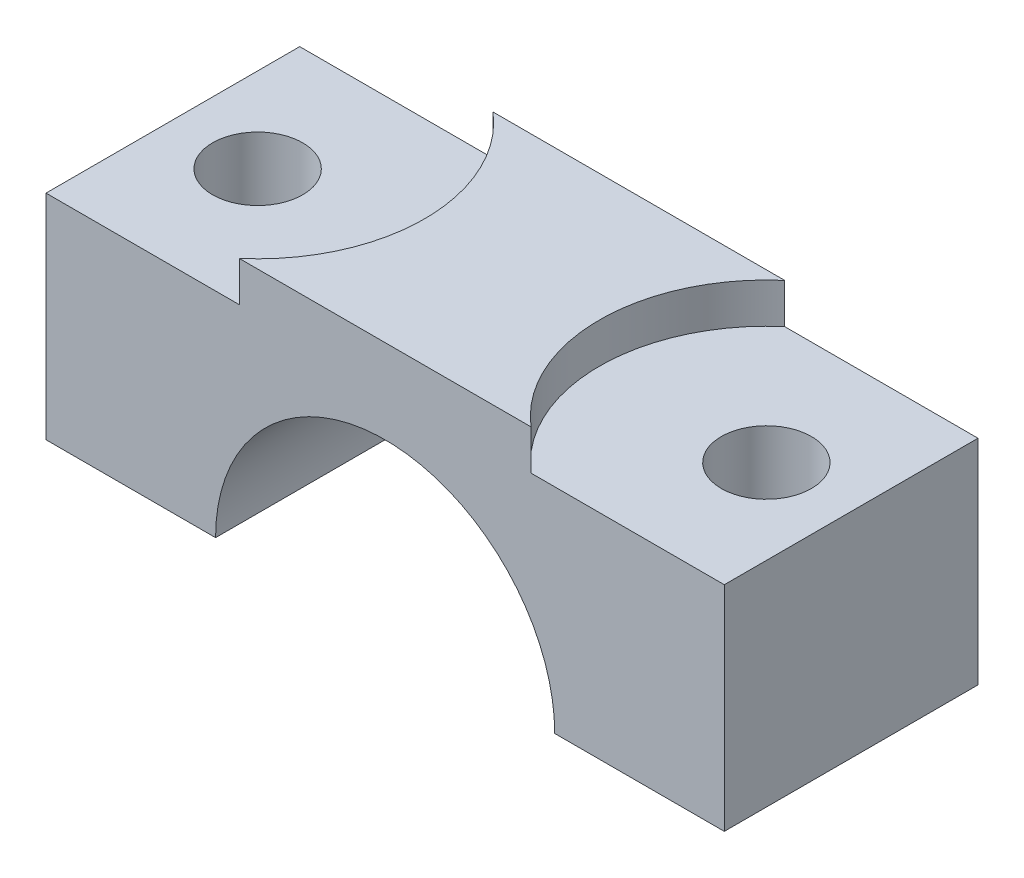
ISO-10303-21;
HEADER;
FILE_DESCRIPTION(('STEP AP214'),'2;1');
FILE_NAME('part.step','',(''),(''),'','','');
FILE_SCHEMA(('AUTOMOTIVE_DESIGN { 1 0 10303 214 1 1 1 1 }'));
ENDSEC;
DATA;
#1=APPLICATION_CONTEXT('core data for automotive mechanical design processes');
#2=APPLICATION_PROTOCOL_DEFINITION('international standard','automotive_design',2000,#1);
#3=PRODUCT_CONTEXT('',#1,'mechanical');
#4=PRODUCT('Part','Part','',(#3));
#5=PRODUCT_RELATED_PRODUCT_CATEGORY('part','',(#4));
#6=PRODUCT_DEFINITION_FORMATION('','',#4);
#7=PRODUCT_DEFINITION_CONTEXT('part definition',#1,'design');
#8=PRODUCT_DEFINITION('design','',#6,#7);
#9=PRODUCT_DEFINITION_SHAPE('','',#8);
#10=(LENGTH_UNIT() NAMED_UNIT(*) SI_UNIT(.MILLI.,.METRE.));
#11=(NAMED_UNIT(*) PLANE_ANGLE_UNIT() SI_UNIT($,.RADIAN.));
#12=(NAMED_UNIT(*) SI_UNIT($,.STERADIAN.) SOLID_ANGLE_UNIT());
#13=UNCERTAINTY_MEASURE_WITH_UNIT(LENGTH_MEASURE(1.E-05),#10,'distance_accuracy_value','');
#14=(GEOMETRIC_REPRESENTATION_CONTEXT(3) GLOBAL_UNCERTAINTY_ASSIGNED_CONTEXT((#13)) GLOBAL_UNIT_ASSIGNED_CONTEXT((#10,
#11,#12)) REPRESENTATION_CONTEXT('',''));
#15=CARTESIAN_POINT('',(0.,0.,0.));
#16=DIRECTION('',(0.,0.,1.));
#17=DIRECTION('',(1.,0.,0.));
#18=AXIS2_PLACEMENT_3D('',#15,#16,#17);
#19=CARTESIAN_POINT('',(-25.4,0.,9.5));
#20=DIRECTION('',(1.,0.,0.));
#21=DIRECTION('',(0.,0.,-1.));
#22=AXIS2_PLACEMENT_3D('',#19,#20,#21);
#23=PLANE('',#22);
#24=DIRECTION('',(0.,-1.,0.));
#25=VECTOR('',#24,1.);
#26=CARTESIAN_POINT('',(-25.4,0.,9.5));
#27=LINE('',#26,#25);
#28=CARTESIAN_POINT('',(-25.4,16.,9.5));
#29=VERTEX_POINT('',#28);
#30=CARTESIAN_POINT('',(-25.4,0.,9.5));
#31=VERTEX_POINT('',#30);
#32=EDGE_CURVE('E150',#29,#31,#27,.T.);
#33=ORIENTED_EDGE('',*,*,#32,.F.);
#34=DIRECTION('',(0.,0.,-1.));
#35=VECTOR('',#34,1.);
#36=CARTESIAN_POINT('',(-25.4,16.,9.5));
#37=LINE('',#36,#35);
#38=CARTESIAN_POINT('',(-25.4,16.,-9.5));
#39=VERTEX_POINT('',#38);
#40=EDGE_CURVE('E115',#29,#39,#37,.T.);
#41=ORIENTED_EDGE('',*,*,#40,.T.);
#42=DIRECTION('',(0.,-1.,0.));
#43=VECTOR('',#42,1.);
#44=CARTESIAN_POINT('',(-25.4,0.,-9.5));
#45=LINE('',#44,#43);
#46=CARTESIAN_POINT('',(-25.4,0.,-9.5));
#47=VERTEX_POINT('',#46);
#48=EDGE_CURVE('E129',#39,#47,#45,.T.);
#49=ORIENTED_EDGE('',*,*,#48,.T.);
#50=DIRECTION('',(0.,0.,-1.));
#51=VECTOR('',#50,1.);
#52=CARTESIAN_POINT('',(-25.4,0.,9.5));
#53=LINE('',#52,#51);
#54=EDGE_CURVE('E185',#31,#47,#53,.T.);
#55=ORIENTED_EDGE('',*,*,#54,.F.);
#56=EDGE_LOOP('',(#33,#41,#49,#55));
#57=FACE_BOUND('',#56,.T.);
#58=ADVANCED_FACE('F33',(#57),#23,.F.);
#59=CARTESIAN_POINT('',(-25.4,0.,9.5));
#60=DIRECTION('',(0.,1.,0.));
#61=DIRECTION('',(-1.,0.,0.));
#62=AXIS2_PLACEMENT_3D('',#59,#60,#61);
#63=PLANE('',#62);
#64=CARTESIAN_POINT('',(-19.05,0.,0.));
#65=DIRECTION('',(0.,1.,0.));
#66=DIRECTION('',(0.,0.,1.));
#67=AXIS2_PLACEMENT_3D('',#64,#65,#66);
#68=CIRCLE('',#67,3.375);
#69=CARTESIAN_POINT('',(-19.05,0.,3.375));
#70=VERTEX_POINT('',#69);
#71=EDGE_CURVE('E116',#70,#70,#68,.T.);
#72=ORIENTED_EDGE('',*,*,#71,.T.);
#73=EDGE_LOOP('',(#72));
#74=FACE_BOUND('',#73,.T.);
#75=DIRECTION('',(1.,0.,0.));
#76=VECTOR('',#75,1.);
#77=CARTESIAN_POINT('',(-25.4,0.,-9.5));
#78=LINE('',#77,#76);
#79=CARTESIAN_POINT('',(-12.7,0.,-9.5));
#80=VERTEX_POINT('',#79);
#81=EDGE_CURVE('E167',#47,#80,#78,.T.);
#82=ORIENTED_EDGE('',*,*,#81,.T.);
#83=DIRECTION('',(0.,0.,-1.));
#84=VECTOR('',#83,1.);
#85=CARTESIAN_POINT('',(-12.7,0.,9.5));
#86=LINE('',#85,#84);
#87=CARTESIAN_POINT('',(-12.7,0.,9.5));
#88=VERTEX_POINT('',#87);
#89=EDGE_CURVE('E182',#88,#80,#86,.T.);
#90=ORIENTED_EDGE('',*,*,#89,.F.);
#91=DIRECTION('',(1.,0.,0.));
#92=VECTOR('',#91,1.);
#93=CARTESIAN_POINT('',(-25.4,0.,9.5));
#94=LINE('',#93,#92);
#95=EDGE_CURVE('E152',#31,#88,#94,.T.);
#96=ORIENTED_EDGE('',*,*,#95,.F.);
#97=ORIENTED_EDGE('',*,*,#54,.T.);
#98=EDGE_LOOP('',(#82,#90,#96,#97));
#99=FACE_BOUND('',#98,.T.);
#100=ADVANCED_FACE('F205',(#74,#99),#63,.F.);
#101=CARTESIAN_POINT('',(0.,0.,9.5));
#102=DIRECTION('',(0.,0.,-1.));
#103=DIRECTION('',(-1.,0.,0.));
#104=AXIS2_PLACEMENT_3D('',#101,#102,#103);
#105=CYLINDRICAL_SURFACE('',#104,12.7);
#106=CARTESIAN_POINT('',(0.,0.,-9.5));
#107=DIRECTION('',(0.,0.,-1.));
#108=DIRECTION('',(-1.,0.,0.));
#109=AXIS2_PLACEMENT_3D('',#106,#107,#108);
#110=CIRCLE('',#109,12.7);
#111=CARTESIAN_POINT('',(12.7,0.,-9.5));
#112=VERTEX_POINT('',#111);
#113=EDGE_CURVE('E169',#80,#112,#110,.T.);
#114=ORIENTED_EDGE('',*,*,#113,.T.);
#115=DIRECTION('',(0.,0.,-1.));
#116=VECTOR('',#115,1.);
#117=CARTESIAN_POINT('',(12.7,0.,9.5));
#118=LINE('',#117,#116);
#119=CARTESIAN_POINT('',(12.7,0.,9.5));
#120=VERTEX_POINT('',#119);
#121=EDGE_CURVE('E179',#120,#112,#118,.T.);
#122=ORIENTED_EDGE('',*,*,#121,.F.);
#123=CARTESIAN_POINT('',(0.,0.,9.5));
#124=DIRECTION('',(0.,0.,-1.));
#125=DIRECTION('',(-1.,0.,0.));
#126=AXIS2_PLACEMENT_3D('',#123,#124,#125);
#127=CIRCLE('',#126,12.7);
#128=EDGE_CURVE('E155',#88,#120,#127,.T.);
#129=ORIENTED_EDGE('',*,*,#128,.F.);
#130=ORIENTED_EDGE('',*,*,#89,.T.);
#131=EDGE_LOOP('',(#114,#122,#129,#130));
#132=FACE_BOUND('',#131,.T.);
#133=ADVANCED_FACE('F225',(#132),#105,.F.);
#134=CARTESIAN_POINT('',(12.7,0.,9.5));
#135=DIRECTION('',(0.,1.,0.));
#136=DIRECTION('',(-1.,0.,0.));
#137=AXIS2_PLACEMENT_3D('',#134,#135,#136);
#138=PLANE('',#137);
#139=CARTESIAN_POINT('',(19.05,0.,0.));
#140=DIRECTION('',(0.,1.,0.));
#141=DIRECTION('',(0.,0.,1.));
#142=AXIS2_PLACEMENT_3D('',#139,#140,#141);
#143=CIRCLE('',#142,3.375);
#144=CARTESIAN_POINT('',(19.05,0.,3.375));
#145=VERTEX_POINT('',#144);
#146=EDGE_CURVE('E140',#145,#145,#143,.T.);
#147=ORIENTED_EDGE('',*,*,#146,.T.);
#148=EDGE_LOOP('',(#147));
#149=FACE_BOUND('',#148,.T.);
#150=DIRECTION('',(1.,0.,0.));
#151=VECTOR('',#150,1.);
#152=CARTESIAN_POINT('',(12.7,0.,-9.5));
#153=LINE('',#152,#151);
#154=CARTESIAN_POINT('',(25.4,0.,-9.5));
#155=VERTEX_POINT('',#154);
#156=EDGE_CURVE('E171',#112,#155,#153,.T.);
#157=ORIENTED_EDGE('',*,*,#156,.T.);
#158=DIRECTION('',(0.,0.,-1.));
#159=VECTOR('',#158,1.);
#160=CARTESIAN_POINT('',(25.4,0.,9.5));
#161=LINE('',#160,#159);
#162=CARTESIAN_POINT('',(25.4,0.,9.5));
#163=VERTEX_POINT('',#162);
#164=EDGE_CURVE('E165',#163,#155,#161,.T.);
#165=ORIENTED_EDGE('',*,*,#164,.F.);
#166=DIRECTION('',(1.,0.,0.));
#167=VECTOR('',#166,1.);
#168=CARTESIAN_POINT('',(12.7,0.,9.5));
#169=LINE('',#168,#167);
#170=EDGE_CURVE('E157',#120,#163,#169,.T.);
#171=ORIENTED_EDGE('',*,*,#170,.F.);
#172=ORIENTED_EDGE('',*,*,#121,.T.);
#173=EDGE_LOOP('',(#157,#165,#171,#172));
#174=FACE_BOUND('',#173,.T.);
#175=ADVANCED_FACE('F237',(#149,#174),#138,.F.);
#176=CARTESIAN_POINT('',(25.4,0.,9.5));
#177=DIRECTION('',(-1.,0.,0.));
#178=DIRECTION('',(0.,0.,1.));
#179=AXIS2_PLACEMENT_3D('',#176,#177,#178);
#180=PLANE('',#179);
#181=DIRECTION('',(0.,1.,0.));
#182=VECTOR('',#181,1.);
#183=CARTESIAN_POINT('',(25.4,0.,-9.5));
#184=LINE('',#183,#182);
#185=CARTESIAN_POINT('',(25.4,16.,-9.5));
#186=VERTEX_POINT('',#185);
#187=EDGE_CURVE('E173',#155,#186,#184,.T.);
#188=ORIENTED_EDGE('',*,*,#187,.T.);
#189=DIRECTION('',(0.,0.,1.));
#190=VECTOR('',#189,1.);
#191=CARTESIAN_POINT('',(25.4,16.,9.5));
#192=LINE('',#191,#190);
#193=CARTESIAN_POINT('',(25.4,16.,9.5));
#194=VERTEX_POINT('',#193);
#195=EDGE_CURVE('E145',#186,#194,#192,.T.);
#196=ORIENTED_EDGE('',*,*,#195,.T.);
#197=DIRECTION('',(0.,1.,0.));
#198=VECTOR('',#197,1.);
#199=CARTESIAN_POINT('',(25.4,0.,9.5));
#200=LINE('',#199,#198);
#201=EDGE_CURVE('E159',#163,#194,#200,.T.);
#202=ORIENTED_EDGE('',*,*,#201,.F.);
#203=ORIENTED_EDGE('',*,*,#164,.T.);
#204=EDGE_LOOP('',(#188,#196,#202,#203));
#205=FACE_BOUND('',#204,.T.);
#206=ADVANCED_FACE('F241',(#205),#180,.F.);
#207=CARTESIAN_POINT('',(-25.4,19.,9.5));
#208=DIRECTION('',(0.,-1.,0.));
#209=DIRECTION('',(0.,0.,-1.));
#210=AXIS2_PLACEMENT_3D('',#207,#208,#209);
#211=PLANE('',#210);
#212=DIRECTION('',(-1.,0.,0.));
#213=VECTOR('',#212,1.);
#214=CARTESIAN_POINT('',(-25.4,19.,-9.5));
#215=LINE('',#214,#213);
#216=CARTESIAN_POINT('',(10.925961595364,19.,-9.5));
#217=VERTEX_POINT('',#216);
#218=CARTESIAN_POINT('',(-10.925961595364,19.,-9.5));
#219=VERTEX_POINT('',#218);
#220=EDGE_CURVE('E153',#217,#219,#215,.T.);
#221=ORIENTED_EDGE('',*,*,#220,.T.);
#222=CARTESIAN_POINT('',(-19.05,19.,0.));
#223=DIRECTION('',(0.,1.,0.));
#224=DIRECTION('',(0.,0.,1.));
#225=AXIS2_PLACEMENT_3D('',#222,#223,#224);
#226=CIRCLE('',#225,12.5);
#227=CARTESIAN_POINT('',(-10.925961595364,19.,9.5));
#228=VERTEX_POINT('',#227);
#229=EDGE_CURVE('E110',#228,#219,#226,.T.);
#230=ORIENTED_EDGE('',*,*,#229,.F.);
#231=DIRECTION('',(-1.,0.,0.));
#232=VECTOR('',#231,1.);
#233=CARTESIAN_POINT('',(-25.4,19.,9.5));
#234=LINE('',#233,#232);
#235=CARTESIAN_POINT('',(10.925961595364,19.,9.5));
#236=VERTEX_POINT('',#235);
#237=EDGE_CURVE('E162',#236,#228,#234,.T.);
#238=ORIENTED_EDGE('',*,*,#237,.F.);
#239=CARTESIAN_POINT('',(19.05,19.,0.));
#240=DIRECTION('',(0.,1.,0.));
#241=DIRECTION('',(0.,0.,1.));
#242=AXIS2_PLACEMENT_3D('',#239,#240,#241);
#243=CIRCLE('',#242,12.5);
#244=EDGE_CURVE('E55',#217,#236,#243,.T.);
#245=ORIENTED_EDGE('',*,*,#244,.F.);
#246=EDGE_LOOP('',(#221,#230,#238,#245));
#247=FACE_BOUND('',#246,.T.);
#248=ADVANCED_FACE('F197',(#247),#211,.F.);
#249=CARTESIAN_POINT('',(0.,0.,9.5));
#250=DIRECTION('',(0.,0.,-1.));
#251=DIRECTION('',(-1.,0.,0.));
#252=AXIS2_PLACEMENT_3D('',#249,#250,#251);
#253=PLANE('',#252);
#254=DIRECTION('',(0.,1.,0.));
#255=VECTOR('',#254,1.);
#256=CARTESIAN_POINT('',(-10.925961595364,19.,9.5));
#257=LINE('',#256,#255);
#258=CARTESIAN_POINT('',(-10.925961595364,16.,9.5));
#259=VERTEX_POINT('',#258);
#260=EDGE_CURVE('E40',#228,#259,#257,.F.);
#261=ORIENTED_EDGE('',*,*,#260,.T.);
#262=DIRECTION('',(-1.,0.,0.));
#263=VECTOR('',#262,1.);
#264=CARTESIAN_POINT('',(0.,16.,9.5));
#265=LINE('',#264,#263);
#266=EDGE_CURVE('E11',#259,#29,#265,.T.);
#267=ORIENTED_EDGE('',*,*,#266,.T.);
#268=ORIENTED_EDGE('',*,*,#32,.T.);
#269=ORIENTED_EDGE('',*,*,#95,.T.);
#270=ORIENTED_EDGE('',*,*,#128,.T.);
#271=ORIENTED_EDGE('',*,*,#170,.T.);
#272=ORIENTED_EDGE('',*,*,#201,.T.);
#273=DIRECTION('',(-1.,0.,0.));
#274=VECTOR('',#273,1.);
#275=CARTESIAN_POINT('',(0.,16.,9.5));
#276=LINE('',#275,#274);
#277=CARTESIAN_POINT('',(10.925961595364,16.,9.5));
#278=VERTEX_POINT('',#277);
#279=EDGE_CURVE('E190',#194,#278,#276,.T.);
#280=ORIENTED_EDGE('',*,*,#279,.T.);
#281=DIRECTION('',(0.,1.,0.));
#282=VECTOR('',#281,1.);
#283=CARTESIAN_POINT('',(10.925961595364,19.,9.5));
#284=LINE('',#283,#282);
#285=EDGE_CURVE('E188',#278,#236,#284,.T.);
#286=ORIENTED_EDGE('',*,*,#285,.T.);
#287=ORIENTED_EDGE('',*,*,#237,.T.);
#288=EDGE_LOOP('',(#261,#267,#268,#269,#270,#271,#272,#280,#286,#287));
#289=FACE_BOUND('',#288,.T.);
#290=ADVANCED_FACE('F193',(#289),#253,.F.);
#291=CARTESIAN_POINT('',(0.,0.,-9.5));
#292=DIRECTION('',(0.,0.,-1.));
#293=DIRECTION('',(-1.,0.,0.));
#294=AXIS2_PLACEMENT_3D('',#291,#292,#293);
#295=PLANE('',#294);
#296=DIRECTION('',(-1.,0.,0.));
#297=VECTOR('',#296,1.);
#298=CARTESIAN_POINT('',(0.,16.,-9.5));
#299=LINE('',#298,#297);
#300=CARTESIAN_POINT('',(-10.925961595364,16.,-9.5));
#301=VERTEX_POINT('',#300);
#302=EDGE_CURVE('E121',#301,#39,#299,.T.);
#303=ORIENTED_EDGE('',*,*,#302,.F.);
#304=DIRECTION('',(0.,1.,0.));
#305=VECTOR('',#304,1.);
#306=CARTESIAN_POINT('',(-10.925961595364,19.,-9.5));
#307=LINE('',#306,#305);
#308=EDGE_CURVE('E107',#219,#301,#307,.F.);
#309=ORIENTED_EDGE('',*,*,#308,.F.);
#310=ORIENTED_EDGE('',*,*,#220,.F.);
#311=DIRECTION('',(0.,1.,0.));
#312=VECTOR('',#311,1.);
#313=CARTESIAN_POINT('',(10.925961595364,19.,-9.5));
#314=LINE('',#313,#312);
#315=CARTESIAN_POINT('',(10.925961595364,16.,-9.5));
#316=VERTEX_POINT('',#315);
#317=EDGE_CURVE('E143',#316,#217,#314,.T.);
#318=ORIENTED_EDGE('',*,*,#317,.F.);
#319=DIRECTION('',(-1.,0.,0.));
#320=VECTOR('',#319,1.);
#321=CARTESIAN_POINT('',(0.,16.,-9.5));
#322=LINE('',#321,#320);
#323=EDGE_CURVE('E148',#186,#316,#322,.T.);
#324=ORIENTED_EDGE('',*,*,#323,.F.);
#325=ORIENTED_EDGE('',*,*,#187,.F.);
#326=ORIENTED_EDGE('',*,*,#156,.F.);
#327=ORIENTED_EDGE('',*,*,#113,.F.);
#328=ORIENTED_EDGE('',*,*,#81,.F.);
#329=ORIENTED_EDGE('',*,*,#48,.F.);
#330=EDGE_LOOP('',(#303,#309,#310,#318,#324,#325,#326,#327,#328,#329));
#331=FACE_BOUND('',#330,.T.);
#332=ADVANCED_FACE('F127',(#331),#295,.T.);
#333=CARTESIAN_POINT('',(19.05,19.,0.));
#334=DIRECTION('',(0.,1.,0.));
#335=DIRECTION('',(0.,0.,1.));
#336=AXIS2_PLACEMENT_3D('',#333,#334,#335);
#337=CYLINDRICAL_SURFACE('',#336,3.375);
#338=ORIENTED_EDGE('',*,*,#146,.F.);
#339=EDGE_LOOP('',(#338));
#340=FACE_BOUND('',#339,.T.);
#341=CARTESIAN_POINT('',(19.05,16.,0.));
#342=DIRECTION('',(0.,1.,0.));
#343=DIRECTION('',(0.,0.,1.));
#344=AXIS2_PLACEMENT_3D('',#341,#342,#343);
#345=CIRCLE('',#344,3.375);
#346=CARTESIAN_POINT('',(19.05,16.,3.375));
#347=VERTEX_POINT('',#346);
#348=EDGE_CURVE('E137',#347,#347,#345,.T.);
#349=ORIENTED_EDGE('',*,*,#348,.T.);
#350=EDGE_LOOP('',(#349));
#351=FACE_BOUND('',#350,.T.);
#352=ADVANCED_FACE('F253',(#340,#351),#337,.F.);
#353=CARTESIAN_POINT('',(22.425,16.,0.));
#354=DIRECTION('',(0.,-1.,0.));
#355=DIRECTION('',(0.,0.,-1.));
#356=AXIS2_PLACEMENT_3D('',#353,#354,#355);
#357=PLANE('',#356);
#358=ORIENTED_EDGE('',*,*,#323,.T.);
#359=CARTESIAN_POINT('',(19.05,16.,0.));
#360=DIRECTION('',(0.,1.,0.));
#361=DIRECTION('',(0.,0.,1.));
#362=AXIS2_PLACEMENT_3D('',#359,#360,#361);
#363=CIRCLE('',#362,12.5);
#364=EDGE_CURVE('E131',#316,#278,#363,.T.);
#365=ORIENTED_EDGE('',*,*,#364,.T.);
#366=ORIENTED_EDGE('',*,*,#279,.F.);
#367=ORIENTED_EDGE('',*,*,#195,.F.);
#368=EDGE_LOOP('',(#358,#365,#366,#367));
#369=FACE_BOUND('',#368,.T.);
#370=ORIENTED_EDGE('',*,*,#348,.F.);
#371=EDGE_LOOP('',(#370));
#372=FACE_BOUND('',#371,.T.);
#373=ADVANCED_FACE('F244',(#369,#372),#357,.F.);
#374=CARTESIAN_POINT('',(19.05,19.,0.));
#375=DIRECTION('',(0.,1.,0.));
#376=DIRECTION('',(0.,0.,1.));
#377=AXIS2_PLACEMENT_3D('',#374,#375,#376);
#378=CYLINDRICAL_SURFACE('',#377,12.5);
#379=ORIENTED_EDGE('',*,*,#317,.T.);
#380=ORIENTED_EDGE('',*,*,#244,.T.);
#381=ORIENTED_EDGE('',*,*,#285,.F.);
#382=ORIENTED_EDGE('',*,*,#364,.F.);
#383=EDGE_LOOP('',(#379,#380,#381,#382));
#384=FACE_BOUND('',#383,.T.);
#385=ADVANCED_FACE('F211',(#384),#378,.F.);
#386=CARTESIAN_POINT('',(-19.05,19.,0.));
#387=DIRECTION('',(0.,1.,0.));
#388=DIRECTION('',(0.,0.,1.));
#389=AXIS2_PLACEMENT_3D('',#386,#387,#388);
#390=CYLINDRICAL_SURFACE('',#389,3.375);
#391=ORIENTED_EDGE('',*,*,#71,.F.);
#392=EDGE_LOOP('',(#391));
#393=FACE_BOUND('',#392,.T.);
#394=CARTESIAN_POINT('',(-19.05,16.,0.));
#395=DIRECTION('',(0.,1.,0.));
#396=DIRECTION('',(0.,0.,1.));
#397=AXIS2_PLACEMENT_3D('',#394,#395,#396);
#398=CIRCLE('',#397,3.375);
#399=CARTESIAN_POINT('',(-19.05,16.,3.375));
#400=VERTEX_POINT('',#399);
#401=EDGE_CURVE('E124',#400,#400,#398,.T.);
#402=ORIENTED_EDGE('',*,*,#401,.T.);
#403=EDGE_LOOP('',(#402));
#404=FACE_BOUND('',#403,.T.);
#405=ADVANCED_FACE('F208',(#393,#404),#390,.F.);
#406=CARTESIAN_POINT('',(-15.675,16.,0.));
#407=DIRECTION('',(0.,-1.,0.));
#408=DIRECTION('',(0.,0.,-1.));
#409=AXIS2_PLACEMENT_3D('',#406,#407,#408);
#410=PLANE('',#409);
#411=ORIENTED_EDGE('',*,*,#302,.T.);
#412=ORIENTED_EDGE('',*,*,#40,.F.);
#413=ORIENTED_EDGE('',*,*,#266,.F.);
#414=CARTESIAN_POINT('',(-19.05,16.,0.));
#415=DIRECTION('',(0.,1.,0.));
#416=DIRECTION('',(0.,0.,1.));
#417=AXIS2_PLACEMENT_3D('',#414,#415,#416);
#418=CIRCLE('',#417,12.5);
#419=EDGE_CURVE('E47',#259,#301,#418,.T.);
#420=ORIENTED_EDGE('',*,*,#419,.T.);
#421=EDGE_LOOP('',(#411,#412,#413,#420));
#422=FACE_BOUND('',#421,.T.);
#423=ORIENTED_EDGE('',*,*,#401,.F.);
#424=EDGE_LOOP('',(#423));
#425=FACE_BOUND('',#424,.T.);
#426=ADVANCED_FACE('F119',(#422,#425),#410,.F.);
#427=CARTESIAN_POINT('',(-19.05,19.,0.));
#428=DIRECTION('',(0.,1.,0.));
#429=DIRECTION('',(0.,0.,1.));
#430=AXIS2_PLACEMENT_3D('',#427,#428,#429);
#431=CYLINDRICAL_SURFACE('',#430,12.5);
#432=ORIENTED_EDGE('',*,*,#308,.T.);
#433=ORIENTED_EDGE('',*,*,#419,.F.);
#434=ORIENTED_EDGE('',*,*,#260,.F.);
#435=ORIENTED_EDGE('',*,*,#229,.T.);
#436=EDGE_LOOP('',(#432,#433,#434,#435));
#437=FACE_BOUND('',#436,.T.);
#438=ADVANCED_FACE('F108',(#437),#431,.F.);
#439=CLOSED_SHELL('',(#58,#100,#133,#175,#206,#248,#290,#332,#352,#373,#385,#405,#426,#438));
#440=MANIFOLD_SOLID_BREP('B2',#439);
#441=ADVANCED_BREP_SHAPE_REPRESENTATION('',(#18,#440),#14);
#442=SHAPE_DEFINITION_REPRESENTATION(#9,#441);
ENDSEC;
END-ISO-10303-21;
